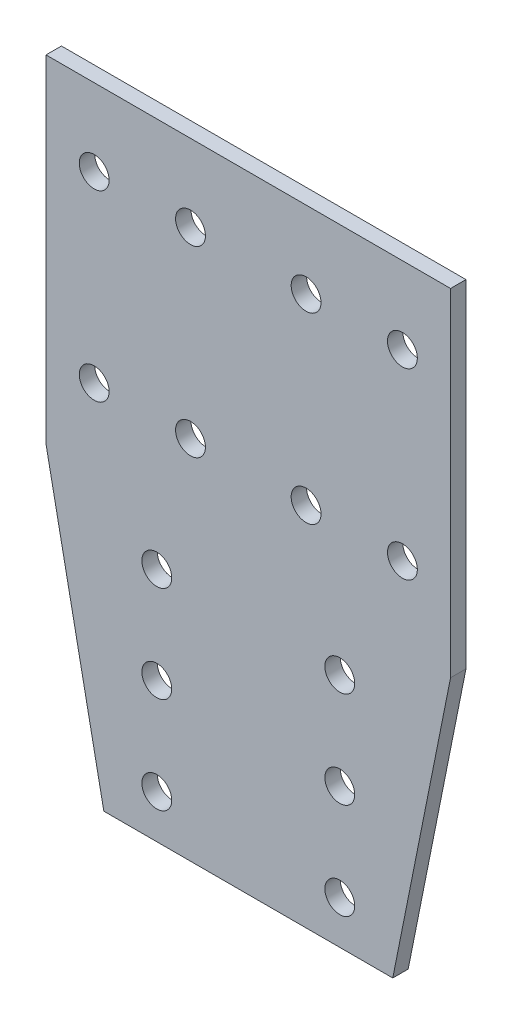
ISO-10303-21;
HEADER;
FILE_DESCRIPTION(('STEP AP214'),'2;1');
FILE_NAME('part.step','',(''),(''),'','','');
FILE_SCHEMA(('AUTOMOTIVE_DESIGN { 1 0 10303 214 1 1 1 1 }'));
ENDSEC;
DATA;
#1=APPLICATION_CONTEXT('core data for automotive mechanical design processes');
#2=APPLICATION_PROTOCOL_DEFINITION('international standard','automotive_design',2000,#1);
#3=PRODUCT_CONTEXT('',#1,'mechanical');
#4=PRODUCT('Part','Part','',(#3));
#5=PRODUCT_RELATED_PRODUCT_CATEGORY('part','',(#4));
#6=PRODUCT_DEFINITION_FORMATION('','',#4);
#7=PRODUCT_DEFINITION_CONTEXT('part definition',#1,'design');
#8=PRODUCT_DEFINITION('design','',#6,#7);
#9=PRODUCT_DEFINITION_SHAPE('','',#8);
#10=(LENGTH_UNIT() NAMED_UNIT(*) SI_UNIT(.MILLI.,.METRE.));
#11=(NAMED_UNIT(*) PLANE_ANGLE_UNIT() SI_UNIT($,.RADIAN.));
#12=(NAMED_UNIT(*) SI_UNIT($,.STERADIAN.) SOLID_ANGLE_UNIT());
#13=UNCERTAINTY_MEASURE_WITH_UNIT(LENGTH_MEASURE(1.E-05),#10,'distance_accuracy_value','');
#14=(GEOMETRIC_REPRESENTATION_CONTEXT(3) GLOBAL_UNCERTAINTY_ASSIGNED_CONTEXT((#13)) GLOBAL_UNIT_ASSIGNED_CONTEXT((#10,
#11,#12)) REPRESENTATION_CONTEXT('',''));
#15=CARTESIAN_POINT('',(0.,0.,0.));
#16=DIRECTION('',(0.,0.,1.));
#17=DIRECTION('',(1.,0.,0.));
#18=AXIS2_PLACEMENT_3D('',#15,#16,#17);
#19=CARTESIAN_POINT('',(-39.2199094965854,-300.,16.));
#20=DIRECTION('',(0.,0.,1.));
#21=DIRECTION('',(1.,0.,0.));
#22=AXIS2_PLACEMENT_3D('',#19,#20,#21);
#23=PLANE('',#22);
#24=CARTESIAN_POINT('',(265.780090503415,-54.9999999999999,16.));
#25=DIRECTION('',(0.,0.,1.));
#26=DIRECTION('',(-1.,0.,0.));
#27=AXIS2_PLACEMENT_3D('',#24,#25,#26);
#28=CIRCLE('',#27,15.5);
#29=CARTESIAN_POINT('',(250.280090503415,-54.9999999999999,16.));
#30=VERTEX_POINT('',#29);
#31=EDGE_CURVE('E227',#30,#30,#28,.T.);
#32=ORIENTED_EDGE('',*,*,#31,.F.);
#33=EDGE_LOOP('',(#32));
#34=FACE_BOUND('',#33,.T.);
#35=CARTESIAN_POINT('',(230.780090503415,80.0000000000001,16.));
#36=DIRECTION('',(0.,0.,1.));
#37=DIRECTION('',(-1.,0.,0.));
#38=AXIS2_PLACEMENT_3D('',#35,#36,#37);
#39=CIRCLE('',#38,15.5);
#40=CARTESIAN_POINT('',(215.280090503415,80.0000000000001,16.));
#41=VERTEX_POINT('',#40);
#42=EDGE_CURVE('E239',#41,#41,#39,.T.);
#43=ORIENTED_EDGE('',*,*,#42,.F.);
#44=EDGE_LOOP('',(#43));
#45=FACE_BOUND('',#44,.T.);
#46=CARTESIAN_POINT('',(230.780090503415,270.,16.));
#47=DIRECTION('',(0.,0.,1.));
#48=DIRECTION('',(1.,0.,0.));
#49=AXIS2_PLACEMENT_3D('',#46,#47,#48);
#50=CIRCLE('',#49,15.5);
#51=CARTESIAN_POINT('',(246.280090503415,270.,16.));
#52=VERTEX_POINT('',#51);
#53=EDGE_CURVE('E251',#52,#52,#50,.T.);
#54=ORIENTED_EDGE('',*,*,#53,.F.);
#55=EDGE_LOOP('',(#54));
#56=FACE_BOUND('',#55,.T.);
#57=CARTESIAN_POINT('',(10.7800905034145,270.,16.));
#58=DIRECTION('',(0.,0.,1.));
#59=DIRECTION('',(-1.,0.,0.));
#60=AXIS2_PLACEMENT_3D('',#57,#58,#59);
#61=CIRCLE('',#60,15.5);
#62=CARTESIAN_POINT('',(-4.71990949658551,270.,16.));
#63=VERTEX_POINT('',#62);
#64=EDGE_CURVE('E263',#63,#63,#61,.T.);
#65=ORIENTED_EDGE('',*,*,#64,.F.);
#66=EDGE_LOOP('',(#65));
#67=FACE_BOUND('',#66,.T.);
#68=CARTESIAN_POINT('',(10.7800905034145,80.0000000000001,16.));
#69=DIRECTION('',(0.,0.,1.));
#70=DIRECTION('',(1.,0.,0.));
#71=AXIS2_PLACEMENT_3D('',#68,#69,#70);
#72=CIRCLE('',#71,15.5);
#73=CARTESIAN_POINT('',(26.2800905034145,80.0000000000001,16.));
#74=VERTEX_POINT('',#73);
#75=EDGE_CURVE('E275',#74,#74,#72,.T.);
#76=ORIENTED_EDGE('',*,*,#75,.F.);
#77=EDGE_LOOP('',(#76));
#78=FACE_BOUND('',#77,.T.);
#79=CARTESIAN_POINT('',(75.7800905034145,-155.,16.));
#80=DIRECTION('',(0.,0.,1.));
#81=DIRECTION('',(1.,0.,0.));
#82=AXIS2_PLACEMENT_3D('',#79,#80,#81);
#83=CIRCLE('',#82,15.5);
#84=CARTESIAN_POINT('',(91.2800905034145,-155.,16.));
#85=VERTEX_POINT('',#84);
#86=EDGE_CURVE('E287',#85,#85,#83,.T.);
#87=ORIENTED_EDGE('',*,*,#86,.F.);
#88=EDGE_LOOP('',(#87));
#89=FACE_BOUND('',#88,.T.);
#90=CARTESIAN_POINT('',(75.7800905034145,-54.9999999999999,16.));
#91=DIRECTION('',(0.,0.,1.));
#92=DIRECTION('',(1.,0.,0.));
#93=AXIS2_PLACEMENT_3D('',#90,#91,#92);
#94=CIRCLE('',#93,15.5);
#95=CARTESIAN_POINT('',(91.2800905034145,-54.9999999999999,16.));
#96=VERTEX_POINT('',#95);
#97=EDGE_CURVE('E119',#96,#96,#94,.T.);
#98=ORIENTED_EDGE('',*,*,#97,.F.);
#99=EDGE_LOOP('',(#98));
#100=FACE_BOUND('',#99,.T.);
#101=DIRECTION('',(0.,-1.,0.));
#102=VECTOR('',#101,1.);
#103=CARTESIAN_POINT('',(-39.2199094965855,350.,16.));
#104=LINE('',#103,#102);
#105=CARTESIAN_POINT('',(-39.2199094965855,350.,16.));
#106=VERTEX_POINT('',#105);
#107=CARTESIAN_POINT('',(-39.2199094965854,0.,16.));
#108=VERTEX_POINT('',#107);
#109=EDGE_CURVE('E126',#106,#108,#104,.T.);
#110=ORIENTED_EDGE('',*,*,#109,.T.);
#111=DIRECTION('',(0.196116135138184,-0.98058067569092,0.));
#112=VECTOR('',#111,1.);
#113=CARTESIAN_POINT('',(-39.2199094965854,0.,16.));
#114=LINE('',#113,#112);
#115=CARTESIAN_POINT('',(20.7800905034145,-300.,16.));
#116=VERTEX_POINT('',#115);
#117=EDGE_CURVE('E84',#108,#116,#114,.T.);
#118=ORIENTED_EDGE('',*,*,#117,.T.);
#119=DIRECTION('',(1.,0.,0.));
#120=VECTOR('',#119,1.);
#121=CARTESIAN_POINT('',(20.7800905034145,-300.,16.));
#122=LINE('',#121,#120);
#123=CARTESIAN_POINT('',(320.780090503414,-300.,16.));
#124=VERTEX_POINT('',#123);
#125=EDGE_CURVE('E97',#116,#124,#122,.T.);
#126=ORIENTED_EDGE('',*,*,#125,.T.);
#127=DIRECTION('',(0.196116135138184,0.98058067569092,0.));
#128=VECTOR('',#127,1.);
#129=CARTESIAN_POINT('',(380.780090503414,0.,16.));
#130=LINE('',#129,#128);
#131=CARTESIAN_POINT('',(380.780090503414,0.,16.));
#132=VERTEX_POINT('',#131);
#133=EDGE_CURVE('E91',#124,#132,#130,.T.);
#134=ORIENTED_EDGE('',*,*,#133,.T.);
#135=DIRECTION('',(0.,1.,0.));
#136=VECTOR('',#135,1.);
#137=CARTESIAN_POINT('',(380.780090503414,350.,16.));
#138=LINE('',#137,#136);
#139=CARTESIAN_POINT('',(380.780090503414,350.,16.));
#140=VERTEX_POINT('',#139);
#141=EDGE_CURVE('E95',#132,#140,#138,.T.);
#142=ORIENTED_EDGE('',*,*,#141,.T.);
#143=DIRECTION('',(-1.,0.,0.));
#144=VECTOR('',#143,1.);
#145=CARTESIAN_POINT('',(380.780090503414,350.,16.));
#146=LINE('',#145,#144);
#147=EDGE_CURVE('E47',#140,#106,#146,.T.);
#148=ORIENTED_EDGE('',*,*,#147,.T.);
#149=EDGE_LOOP('',(#110,#118,#126,#134,#142,#148));
#150=FACE_BOUND('',#149,.T.);
#151=CARTESIAN_POINT('',(75.7800905034145,-255.,16.));
#152=DIRECTION('',(0.,0.,1.));
#153=DIRECTION('',(1.,0.,0.));
#154=AXIS2_PLACEMENT_3D('',#151,#152,#153);
#155=CIRCLE('',#154,15.5);
#156=CARTESIAN_POINT('',(91.2800905034145,-255.,16.));
#157=VERTEX_POINT('',#156);
#158=EDGE_CURVE('E293',#157,#157,#155,.T.);
#159=ORIENTED_EDGE('',*,*,#158,.F.);
#160=EDGE_LOOP('',(#159));
#161=FACE_BOUND('',#160,.T.);
#162=CARTESIAN_POINT('',(110.780090503414,80.0000000000001,16.));
#163=DIRECTION('',(0.,0.,1.));
#164=DIRECTION('',(1.,0.,0.));
#165=AXIS2_PLACEMENT_3D('',#162,#163,#164);
#166=CIRCLE('',#165,15.5);
#167=CARTESIAN_POINT('',(126.280090503414,80.0000000000001,16.));
#168=VERTEX_POINT('',#167);
#169=EDGE_CURVE('E281',#168,#168,#166,.T.);
#170=ORIENTED_EDGE('',*,*,#169,.F.);
#171=EDGE_LOOP('',(#170));
#172=FACE_BOUND('',#171,.T.);
#173=CARTESIAN_POINT('',(110.780090503414,270.,16.));
#174=DIRECTION('',(0.,0.,1.));
#175=DIRECTION('',(-1.,0.,0.));
#176=AXIS2_PLACEMENT_3D('',#173,#174,#175);
#177=CIRCLE('',#176,15.5);
#178=CARTESIAN_POINT('',(95.2800905034145,270.,16.));
#179=VERTEX_POINT('',#178);
#180=EDGE_CURVE('E269',#179,#179,#177,.T.);
#181=ORIENTED_EDGE('',*,*,#180,.F.);
#182=EDGE_LOOP('',(#181));
#183=FACE_BOUND('',#182,.T.);
#184=CARTESIAN_POINT('',(330.780090503415,270.,16.));
#185=DIRECTION('',(0.,0.,1.));
#186=DIRECTION('',(1.,0.,0.));
#187=AXIS2_PLACEMENT_3D('',#184,#185,#186);
#188=CIRCLE('',#187,15.5);
#189=CARTESIAN_POINT('',(346.280090503415,270.,16.));
#190=VERTEX_POINT('',#189);
#191=EDGE_CURVE('E257',#190,#190,#188,.T.);
#192=ORIENTED_EDGE('',*,*,#191,.F.);
#193=EDGE_LOOP('',(#192));
#194=FACE_BOUND('',#193,.T.);
#195=CARTESIAN_POINT('',(330.780090503415,80.0000000000001,16.));
#196=DIRECTION('',(0.,0.,1.));
#197=DIRECTION('',(-1.,0.,0.));
#198=AXIS2_PLACEMENT_3D('',#195,#196,#197);
#199=CIRCLE('',#198,15.5);
#200=CARTESIAN_POINT('',(315.280090503415,80.0000000000001,16.));
#201=VERTEX_POINT('',#200);
#202=EDGE_CURVE('E245',#201,#201,#199,.T.);
#203=ORIENTED_EDGE('',*,*,#202,.F.);
#204=EDGE_LOOP('',(#203));
#205=FACE_BOUND('',#204,.T.);
#206=CARTESIAN_POINT('',(265.780090503415,-155.,16.));
#207=DIRECTION('',(0.,0.,1.));
#208=DIRECTION('',(-1.,0.,0.));
#209=AXIS2_PLACEMENT_3D('',#206,#207,#208);
#210=CIRCLE('',#209,15.5);
#211=CARTESIAN_POINT('',(250.280090503415,-155.,16.));
#212=VERTEX_POINT('',#211);
#213=EDGE_CURVE('E233',#212,#212,#210,.T.);
#214=ORIENTED_EDGE('',*,*,#213,.F.);
#215=EDGE_LOOP('',(#214));
#216=FACE_BOUND('',#215,.T.);
#217=CARTESIAN_POINT('',(265.780090503415,-255.,16.));
#218=DIRECTION('',(0.,0.,1.));
#219=DIRECTION('',(-1.,0.,0.));
#220=AXIS2_PLACEMENT_3D('',#217,#218,#219);
#221=CIRCLE('',#220,15.5);
#222=CARTESIAN_POINT('',(250.280090503415,-255.,16.));
#223=VERTEX_POINT('',#222);
#224=EDGE_CURVE('E218',#223,#223,#221,.T.);
#225=ORIENTED_EDGE('',*,*,#224,.F.);
#226=EDGE_LOOP('',(#225));
#227=FACE_BOUND('',#226,.T.);
#228=ADVANCED_FACE('F30',(#34,#45,#56,#67,#78,#89,#100,#150,#161,#172,#183,#194,#205,#216,#227),
#23,.T.);
#229=CARTESIAN_POINT('',(-39.2199094965854,-300.,0.));
#230=DIRECTION('',(0.,0.,1.));
#231=DIRECTION('',(1.,0.,0.));
#232=AXIS2_PLACEMENT_3D('',#229,#230,#231);
#233=PLANE('',#232);
#234=CARTESIAN_POINT('',(265.780090503415,-54.9999999999999,0.));
#235=DIRECTION('',(0.,0.,1.));
#236=DIRECTION('',(-1.,0.,0.));
#237=AXIS2_PLACEMENT_3D('',#234,#235,#236);
#238=CIRCLE('',#237,15.5);
#239=CARTESIAN_POINT('',(250.280090503415,-54.9999999999999,0.));
#240=VERTEX_POINT('',#239);
#241=EDGE_CURVE('E224',#240,#240,#238,.T.);
#242=ORIENTED_EDGE('',*,*,#241,.T.);
#243=EDGE_LOOP('',(#242));
#244=FACE_BOUND('',#243,.T.);
#245=CARTESIAN_POINT('',(230.780090503415,80.0000000000001,0.));
#246=DIRECTION('',(0.,0.,1.));
#247=DIRECTION('',(-1.,0.,0.));
#248=AXIS2_PLACEMENT_3D('',#245,#246,#247);
#249=CIRCLE('',#248,15.5);
#250=CARTESIAN_POINT('',(215.280090503415,80.0000000000001,0.));
#251=VERTEX_POINT('',#250);
#252=EDGE_CURVE('E236',#251,#251,#249,.T.);
#253=ORIENTED_EDGE('',*,*,#252,.T.);
#254=EDGE_LOOP('',(#253));
#255=FACE_BOUND('',#254,.T.);
#256=CARTESIAN_POINT('',(230.780090503415,270.,0.));
#257=DIRECTION('',(0.,0.,1.));
#258=DIRECTION('',(1.,0.,0.));
#259=AXIS2_PLACEMENT_3D('',#256,#257,#258);
#260=CIRCLE('',#259,15.5);
#261=CARTESIAN_POINT('',(246.280090503415,270.,0.));
#262=VERTEX_POINT('',#261);
#263=EDGE_CURVE('E248',#262,#262,#260,.T.);
#264=ORIENTED_EDGE('',*,*,#263,.T.);
#265=EDGE_LOOP('',(#264));
#266=FACE_BOUND('',#265,.T.);
#267=CARTESIAN_POINT('',(10.7800905034145,270.,0.));
#268=DIRECTION('',(0.,0.,1.));
#269=DIRECTION('',(-1.,0.,0.));
#270=AXIS2_PLACEMENT_3D('',#267,#268,#269);
#271=CIRCLE('',#270,15.5);
#272=CARTESIAN_POINT('',(-4.71990949658551,270.,0.));
#273=VERTEX_POINT('',#272);
#274=EDGE_CURVE('E260',#273,#273,#271,.T.);
#275=ORIENTED_EDGE('',*,*,#274,.T.);
#276=EDGE_LOOP('',(#275));
#277=FACE_BOUND('',#276,.T.);
#278=CARTESIAN_POINT('',(10.7800905034145,80.0000000000001,0.));
#279=DIRECTION('',(0.,0.,1.));
#280=DIRECTION('',(1.,0.,0.));
#281=AXIS2_PLACEMENT_3D('',#278,#279,#280);
#282=CIRCLE('',#281,15.5);
#283=CARTESIAN_POINT('',(26.2800905034145,80.0000000000001,0.));
#284=VERTEX_POINT('',#283);
#285=EDGE_CURVE('E272',#284,#284,#282,.T.);
#286=ORIENTED_EDGE('',*,*,#285,.T.);
#287=EDGE_LOOP('',(#286));
#288=FACE_BOUND('',#287,.T.);
#289=CARTESIAN_POINT('',(75.7800905034145,-155.,0.));
#290=DIRECTION('',(0.,0.,1.));
#291=DIRECTION('',(1.,0.,0.));
#292=AXIS2_PLACEMENT_3D('',#289,#290,#291);
#293=CIRCLE('',#292,15.5);
#294=CARTESIAN_POINT('',(91.2800905034145,-155.,0.));
#295=VERTEX_POINT('',#294);
#296=EDGE_CURVE('E284',#295,#295,#293,.T.);
#297=ORIENTED_EDGE('',*,*,#296,.T.);
#298=EDGE_LOOP('',(#297));
#299=FACE_BOUND('',#298,.T.);
#300=CARTESIAN_POINT('',(75.7800905034145,-54.9999999999999,0.));
#301=DIRECTION('',(0.,0.,1.));
#302=DIRECTION('',(1.,0.,0.));
#303=AXIS2_PLACEMENT_3D('',#300,#301,#302);
#304=CIRCLE('',#303,15.5);
#305=CARTESIAN_POINT('',(91.2800905034145,-54.9999999999999,0.));
#306=VERTEX_POINT('',#305);
#307=EDGE_CURVE('E296',#306,#306,#304,.T.);
#308=ORIENTED_EDGE('',*,*,#307,.T.);
#309=EDGE_LOOP('',(#308));
#310=FACE_BOUND('',#309,.T.);
#311=DIRECTION('',(0.,-1.,0.));
#312=VECTOR('',#311,1.);
#313=CARTESIAN_POINT('',(-39.2199094965855,350.,0.));
#314=LINE('',#313,#312);
#315=CARTESIAN_POINT('',(-39.2199094965855,350.,0.));
#316=VERTEX_POINT('',#315);
#317=CARTESIAN_POINT('',(-39.2199094965854,0.,0.));
#318=VERTEX_POINT('',#317);
#319=EDGE_CURVE('E115',#316,#318,#314,.T.);
#320=ORIENTED_EDGE('',*,*,#319,.F.);
#321=DIRECTION('',(-1.,0.,0.));
#322=VECTOR('',#321,1.);
#323=CARTESIAN_POINT('',(380.780090503414,350.,0.));
#324=LINE('',#323,#322);
#325=CARTESIAN_POINT('',(380.780090503414,350.,0.));
#326=VERTEX_POINT('',#325);
#327=EDGE_CURVE('E76',#326,#316,#324,.T.);
#328=ORIENTED_EDGE('',*,*,#327,.F.);
#329=DIRECTION('',(0.,1.,0.));
#330=VECTOR('',#329,1.);
#331=CARTESIAN_POINT('',(380.780090503414,350.,0.));
#332=LINE('',#331,#330);
#333=CARTESIAN_POINT('',(380.780090503414,0.,0.));
#334=VERTEX_POINT('',#333);
#335=EDGE_CURVE('E70',#334,#326,#332,.T.);
#336=ORIENTED_EDGE('',*,*,#335,.F.);
#337=DIRECTION('',(0.196116135138184,0.98058067569092,0.));
#338=VECTOR('',#337,1.);
#339=CARTESIAN_POINT('',(380.780090503414,0.,0.));
#340=LINE('',#339,#338);
#341=CARTESIAN_POINT('',(320.780090503414,-300.,0.));
#342=VERTEX_POINT('',#341);
#343=EDGE_CURVE('E105',#342,#334,#340,.T.);
#344=ORIENTED_EDGE('',*,*,#343,.F.);
#345=DIRECTION('',(1.,0.,0.));
#346=VECTOR('',#345,1.);
#347=CARTESIAN_POINT('',(20.7800905034145,-300.,0.));
#348=LINE('',#347,#346);
#349=CARTESIAN_POINT('',(20.7800905034145,-300.,0.));
#350=VERTEX_POINT('',#349);
#351=EDGE_CURVE('E121',#350,#342,#348,.T.);
#352=ORIENTED_EDGE('',*,*,#351,.F.);
#353=DIRECTION('',(0.196116135138184,-0.98058067569092,0.));
#354=VECTOR('',#353,1.);
#355=CARTESIAN_POINT('',(-39.2199094965854,0.,0.));
#356=LINE('',#355,#354);
#357=EDGE_CURVE('E118',#318,#350,#356,.T.);
#358=ORIENTED_EDGE('',*,*,#357,.F.);
#359=EDGE_LOOP('',(#320,#328,#336,#344,#352,#358));
#360=FACE_BOUND('',#359,.T.);
#361=CARTESIAN_POINT('',(75.7800905034145,-255.,0.));
#362=DIRECTION('',(0.,0.,1.));
#363=DIRECTION('',(1.,0.,0.));
#364=AXIS2_PLACEMENT_3D('',#361,#362,#363);
#365=CIRCLE('',#364,15.5);
#366=CARTESIAN_POINT('',(91.2800905034145,-255.,0.));
#367=VERTEX_POINT('',#366);
#368=EDGE_CURVE('E290',#367,#367,#365,.T.);
#369=ORIENTED_EDGE('',*,*,#368,.T.);
#370=EDGE_LOOP('',(#369));
#371=FACE_BOUND('',#370,.T.);
#372=CARTESIAN_POINT('',(110.780090503414,80.0000000000001,0.));
#373=DIRECTION('',(0.,0.,1.));
#374=DIRECTION('',(1.,0.,0.));
#375=AXIS2_PLACEMENT_3D('',#372,#373,#374);
#376=CIRCLE('',#375,15.5);
#377=CARTESIAN_POINT('',(126.280090503414,80.0000000000001,0.));
#378=VERTEX_POINT('',#377);
#379=EDGE_CURVE('E278',#378,#378,#376,.T.);
#380=ORIENTED_EDGE('',*,*,#379,.T.);
#381=EDGE_LOOP('',(#380));
#382=FACE_BOUND('',#381,.T.);
#383=CARTESIAN_POINT('',(110.780090503414,270.,0.));
#384=DIRECTION('',(0.,0.,1.));
#385=DIRECTION('',(-1.,0.,0.));
#386=AXIS2_PLACEMENT_3D('',#383,#384,#385);
#387=CIRCLE('',#386,15.5);
#388=CARTESIAN_POINT('',(95.2800905034145,270.,0.));
#389=VERTEX_POINT('',#388);
#390=EDGE_CURVE('E266',#389,#389,#387,.T.);
#391=ORIENTED_EDGE('',*,*,#390,.T.);
#392=EDGE_LOOP('',(#391));
#393=FACE_BOUND('',#392,.T.);
#394=CARTESIAN_POINT('',(330.780090503415,270.,0.));
#395=DIRECTION('',(0.,0.,1.));
#396=DIRECTION('',(1.,0.,0.));
#397=AXIS2_PLACEMENT_3D('',#394,#395,#396);
#398=CIRCLE('',#397,15.5);
#399=CARTESIAN_POINT('',(346.280090503415,270.,0.));
#400=VERTEX_POINT('',#399);
#401=EDGE_CURVE('E254',#400,#400,#398,.T.);
#402=ORIENTED_EDGE('',*,*,#401,.T.);
#403=EDGE_LOOP('',(#402));
#404=FACE_BOUND('',#403,.T.);
#405=CARTESIAN_POINT('',(330.780090503415,80.0000000000001,0.));
#406=DIRECTION('',(0.,0.,1.));
#407=DIRECTION('',(-1.,0.,0.));
#408=AXIS2_PLACEMENT_3D('',#405,#406,#407);
#409=CIRCLE('',#408,15.5);
#410=CARTESIAN_POINT('',(315.280090503415,80.0000000000001,0.));
#411=VERTEX_POINT('',#410);
#412=EDGE_CURVE('E242',#411,#411,#409,.T.);
#413=ORIENTED_EDGE('',*,*,#412,.T.);
#414=EDGE_LOOP('',(#413));
#415=FACE_BOUND('',#414,.T.);
#416=CARTESIAN_POINT('',(265.780090503415,-155.,0.));
#417=DIRECTION('',(0.,0.,1.));
#418=DIRECTION('',(-1.,0.,0.));
#419=AXIS2_PLACEMENT_3D('',#416,#417,#418);
#420=CIRCLE('',#419,15.5);
#421=CARTESIAN_POINT('',(250.280090503415,-155.,0.));
#422=VERTEX_POINT('',#421);
#423=EDGE_CURVE('E230',#422,#422,#420,.T.);
#424=ORIENTED_EDGE('',*,*,#423,.T.);
#425=EDGE_LOOP('',(#424));
#426=FACE_BOUND('',#425,.T.);
#427=CARTESIAN_POINT('',(265.780090503415,-255.,0.));
#428=DIRECTION('',(0.,0.,1.));
#429=DIRECTION('',(-1.,0.,0.));
#430=AXIS2_PLACEMENT_3D('',#427,#428,#429);
#431=CIRCLE('',#430,15.5);
#432=CARTESIAN_POINT('',(250.280090503415,-255.,0.));
#433=VERTEX_POINT('',#432);
#434=EDGE_CURVE('E221',#433,#433,#431,.T.);
#435=ORIENTED_EDGE('',*,*,#434,.T.);
#436=EDGE_LOOP('',(#435));
#437=FACE_BOUND('',#436,.T.);
#438=ADVANCED_FACE('F135',(#244,#255,#266,#277,#288,#299,#310,#360,#371,#382,#393,#404,#415,
#426,#437),#233,.F.);
#439=CARTESIAN_POINT('',(-39.2199094965855,350.,16.));
#440=DIRECTION('',(1.,0.,0.));
#441=DIRECTION('',(0.,1.,0.));
#442=AXIS2_PLACEMENT_3D('',#439,#440,#441);
#443=PLANE('',#442);
#444=ORIENTED_EDGE('',*,*,#319,.T.);
#445=DIRECTION('',(0.,0.,-1.));
#446=VECTOR('',#445,1.);
#447=CARTESIAN_POINT('',(-39.2199094965854,0.,16.));
#448=LINE('',#447,#446);
#449=EDGE_CURVE('E11',#108,#318,#448,.T.);
#450=ORIENTED_EDGE('',*,*,#449,.F.);
#451=ORIENTED_EDGE('',*,*,#109,.F.);
#452=DIRECTION('',(0.,0.,-1.));
#453=VECTOR('',#452,1.);
#454=CARTESIAN_POINT('',(-39.2199094965855,350.,16.));
#455=LINE('',#454,#453);
#456=EDGE_CURVE('E111',#106,#316,#455,.T.);
#457=ORIENTED_EDGE('',*,*,#456,.T.);
#458=EDGE_LOOP('',(#444,#450,#451,#457));
#459=FACE_BOUND('',#458,.T.);
#460=ADVANCED_FACE('F32',(#459),#443,.F.);
#461=CARTESIAN_POINT('',(-39.2199094965854,0.,16.));
#462=DIRECTION('',(0.98058067569092,0.196116135138184,0.));
#463=DIRECTION('',(-0.196116135138184,0.98058067569092,0.));
#464=AXIS2_PLACEMENT_3D('',#461,#462,#463);
#465=PLANE('',#464);
#466=ORIENTED_EDGE('',*,*,#357,.T.);
#467=DIRECTION('',(0.,0.,-1.));
#468=VECTOR('',#467,1.);
#469=CARTESIAN_POINT('',(20.7800905034145,-300.,16.));
#470=LINE('',#469,#468);
#471=EDGE_CURVE('E39',#116,#350,#470,.T.);
#472=ORIENTED_EDGE('',*,*,#471,.F.);
#473=ORIENTED_EDGE('',*,*,#117,.F.);
#474=ORIENTED_EDGE('',*,*,#449,.T.);
#475=EDGE_LOOP('',(#466,#472,#473,#474));
#476=FACE_BOUND('',#475,.T.);
#477=ADVANCED_FACE('F443',(#476),#465,.F.);
#478=CARTESIAN_POINT('',(20.7800905034145,-300.,16.));
#479=DIRECTION('',(0.,1.,0.));
#480=DIRECTION('',(0.,0.,1.));
#481=AXIS2_PLACEMENT_3D('',#478,#479,#480);
#482=PLANE('',#481);
#483=ORIENTED_EDGE('',*,*,#351,.T.);
#484=DIRECTION('',(0.,0.,-1.));
#485=VECTOR('',#484,1.);
#486=CARTESIAN_POINT('',(320.780090503414,-300.,16.));
#487=LINE('',#486,#485);
#488=EDGE_CURVE('E106',#124,#342,#487,.T.);
#489=ORIENTED_EDGE('',*,*,#488,.F.);
#490=ORIENTED_EDGE('',*,*,#125,.F.);
#491=ORIENTED_EDGE('',*,*,#471,.T.);
#492=EDGE_LOOP('',(#483,#489,#490,#491));
#493=FACE_BOUND('',#492,.T.);
#494=ADVANCED_FACE('F132',(#493),#482,.F.);
#495=CARTESIAN_POINT('',(380.780090503414,0.,16.));
#496=DIRECTION('',(-0.98058067569092,0.196116135138184,0.));
#497=DIRECTION('',(-0.196116135138184,-0.98058067569092,0.));
#498=AXIS2_PLACEMENT_3D('',#495,#496,#497);
#499=PLANE('',#498);
#500=ORIENTED_EDGE('',*,*,#343,.T.);
#501=DIRECTION('',(0.,0.,-1.));
#502=VECTOR('',#501,1.);
#503=CARTESIAN_POINT('',(380.780090503414,0.,16.));
#504=LINE('',#503,#502);
#505=EDGE_CURVE('E102',#132,#334,#504,.T.);
#506=ORIENTED_EDGE('',*,*,#505,.F.);
#507=ORIENTED_EDGE('',*,*,#133,.F.);
#508=ORIENTED_EDGE('',*,*,#488,.T.);
#509=EDGE_LOOP('',(#500,#506,#507,#508));
#510=FACE_BOUND('',#509,.T.);
#511=ADVANCED_FACE('F103',(#510),#499,.F.);
#512=CARTESIAN_POINT('',(380.780090503414,350.,16.));
#513=DIRECTION('',(-1.,0.,0.));
#514=DIRECTION('',(0.,0.,1.));
#515=AXIS2_PLACEMENT_3D('',#512,#513,#514);
#516=PLANE('',#515);
#517=ORIENTED_EDGE('',*,*,#335,.T.);
#518=DIRECTION('',(0.,0.,-1.));
#519=VECTOR('',#518,1.);
#520=CARTESIAN_POINT('',(380.780090503414,350.,16.));
#521=LINE('',#520,#519);
#522=EDGE_CURVE('E107',#140,#326,#521,.T.);
#523=ORIENTED_EDGE('',*,*,#522,.F.);
#524=ORIENTED_EDGE('',*,*,#141,.F.);
#525=ORIENTED_EDGE('',*,*,#505,.T.);
#526=EDGE_LOOP('',(#517,#523,#524,#525));
#527=FACE_BOUND('',#526,.T.);
#528=ADVANCED_FACE('F109',(#527),#516,.F.);
#529=CARTESIAN_POINT('',(380.780090503414,350.,16.));
#530=DIRECTION('',(0.,-1.,0.));
#531=DIRECTION('',(0.,0.,-1.));
#532=AXIS2_PLACEMENT_3D('',#529,#530,#531);
#533=PLANE('',#532);
#534=ORIENTED_EDGE('',*,*,#327,.T.);
#535=ORIENTED_EDGE('',*,*,#456,.F.);
#536=ORIENTED_EDGE('',*,*,#147,.F.);
#537=ORIENTED_EDGE('',*,*,#522,.T.);
#538=EDGE_LOOP('',(#534,#535,#536,#537));
#539=FACE_BOUND('',#538,.T.);
#540=ADVANCED_FACE('F140',(#539),#533,.F.);
#541=CARTESIAN_POINT('',(75.7800905034145,-54.9999999999999,16.));
#542=DIRECTION('',(0.,0.,-1.));
#543=DIRECTION('',(-1.,0.,0.));
#544=AXIS2_PLACEMENT_3D('',#541,#542,#543);
#545=CYLINDRICAL_SURFACE('',#544,15.5);
#546=ORIENTED_EDGE('',*,*,#97,.T.);
#547=EDGE_LOOP('',(#546));
#548=FACE_BOUND('',#547,.T.);
#549=ORIENTED_EDGE('',*,*,#307,.F.);
#550=EDGE_LOOP('',(#549));
#551=FACE_BOUND('',#550,.T.);
#552=ADVANCED_FACE('F142',(#548,#551),#545,.F.);
#553=CARTESIAN_POINT('',(75.7800905034145,-255.,16.));
#554=DIRECTION('',(0.,0.,-1.));
#555=DIRECTION('',(-1.,0.,0.));
#556=AXIS2_PLACEMENT_3D('',#553,#554,#555);
#557=CYLINDRICAL_SURFACE('',#556,15.5);
#558=ORIENTED_EDGE('',*,*,#158,.T.);
#559=EDGE_LOOP('',(#558));
#560=FACE_BOUND('',#559,.T.);
#561=ORIENTED_EDGE('',*,*,#368,.F.);
#562=EDGE_LOOP('',(#561));
#563=FACE_BOUND('',#562,.T.);
#564=ADVANCED_FACE('F148',(#560,#563),#557,.F.);
#565=CARTESIAN_POINT('',(75.7800905034145,-155.,16.));
#566=DIRECTION('',(0.,0.,-1.));
#567=DIRECTION('',(-1.,0.,0.));
#568=AXIS2_PLACEMENT_3D('',#565,#566,#567);
#569=CYLINDRICAL_SURFACE('',#568,15.5);
#570=ORIENTED_EDGE('',*,*,#86,.T.);
#571=EDGE_LOOP('',(#570));
#572=FACE_BOUND('',#571,.T.);
#573=ORIENTED_EDGE('',*,*,#296,.F.);
#574=EDGE_LOOP('',(#573));
#575=FACE_BOUND('',#574,.T.);
#576=ADVANCED_FACE('F165',(#572,#575),#569,.F.);
#577=CARTESIAN_POINT('',(110.780090503414,80.0000000000001,16.));
#578=DIRECTION('',(0.,0.,-1.));
#579=DIRECTION('',(-1.,0.,0.));
#580=AXIS2_PLACEMENT_3D('',#577,#578,#579);
#581=CYLINDRICAL_SURFACE('',#580,15.5);
#582=ORIENTED_EDGE('',*,*,#169,.T.);
#583=EDGE_LOOP('',(#582));
#584=FACE_BOUND('',#583,.T.);
#585=ORIENTED_EDGE('',*,*,#379,.F.);
#586=EDGE_LOOP('',(#585));
#587=FACE_BOUND('',#586,.T.);
#588=ADVANCED_FACE('F169',(#584,#587),#581,.F.);
#589=CARTESIAN_POINT('',(10.7800905034145,80.0000000000001,16.));
#590=DIRECTION('',(0.,0.,-1.));
#591=DIRECTION('',(-1.,0.,0.));
#592=AXIS2_PLACEMENT_3D('',#589,#590,#591);
#593=CYLINDRICAL_SURFACE('',#592,15.5);
#594=ORIENTED_EDGE('',*,*,#75,.T.);
#595=EDGE_LOOP('',(#594));
#596=FACE_BOUND('',#595,.T.);
#597=ORIENTED_EDGE('',*,*,#285,.F.);
#598=EDGE_LOOP('',(#597));
#599=FACE_BOUND('',#598,.T.);
#600=ADVANCED_FACE('F173',(#596,#599),#593,.F.);
#601=CARTESIAN_POINT('',(110.780090503414,270.,16.));
#602=DIRECTION('',(0.,0.,-1.));
#603=DIRECTION('',(-1.,0.,0.));
#604=AXIS2_PLACEMENT_3D('',#601,#602,#603);
#605=CYLINDRICAL_SURFACE('',#604,15.5);
#606=ORIENTED_EDGE('',*,*,#180,.T.);
#607=EDGE_LOOP('',(#606));
#608=FACE_BOUND('',#607,.T.);
#609=ORIENTED_EDGE('',*,*,#390,.F.);
#610=EDGE_LOOP('',(#609));
#611=FACE_BOUND('',#610,.T.);
#612=ADVANCED_FACE('F177',(#608,#611),#605,.F.);
#613=CARTESIAN_POINT('',(10.7800905034145,270.,16.));
#614=DIRECTION('',(0.,0.,-1.));
#615=DIRECTION('',(-1.,0.,0.));
#616=AXIS2_PLACEMENT_3D('',#613,#614,#615);
#617=CYLINDRICAL_SURFACE('',#616,15.5);
#618=ORIENTED_EDGE('',*,*,#64,.T.);
#619=EDGE_LOOP('',(#618));
#620=FACE_BOUND('',#619,.T.);
#621=ORIENTED_EDGE('',*,*,#274,.F.);
#622=EDGE_LOOP('',(#621));
#623=FACE_BOUND('',#622,.T.);
#624=ADVANCED_FACE('F181',(#620,#623),#617,.F.);
#625=CARTESIAN_POINT('',(330.780090503415,270.,16.));
#626=DIRECTION('',(0.,0.,-1.));
#627=DIRECTION('',(-1.,0.,0.));
#628=AXIS2_PLACEMENT_3D('',#625,#626,#627);
#629=CYLINDRICAL_SURFACE('',#628,15.5);
#630=ORIENTED_EDGE('',*,*,#191,.T.);
#631=EDGE_LOOP('',(#630));
#632=FACE_BOUND('',#631,.T.);
#633=ORIENTED_EDGE('',*,*,#401,.F.);
#634=EDGE_LOOP('',(#633));
#635=FACE_BOUND('',#634,.T.);
#636=ADVANCED_FACE('F185',(#632,#635),#629,.F.);
#637=CARTESIAN_POINT('',(230.780090503415,270.,16.));
#638=DIRECTION('',(0.,0.,-1.));
#639=DIRECTION('',(-1.,0.,0.));
#640=AXIS2_PLACEMENT_3D('',#637,#638,#639);
#641=CYLINDRICAL_SURFACE('',#640,15.5);
#642=ORIENTED_EDGE('',*,*,#53,.T.);
#643=EDGE_LOOP('',(#642));
#644=FACE_BOUND('',#643,.T.);
#645=ORIENTED_EDGE('',*,*,#263,.F.);
#646=EDGE_LOOP('',(#645));
#647=FACE_BOUND('',#646,.T.);
#648=ADVANCED_FACE('F189',(#644,#647),#641,.F.);
#649=CARTESIAN_POINT('',(330.780090503415,80.0000000000001,16.));
#650=DIRECTION('',(0.,0.,-1.));
#651=DIRECTION('',(-1.,0.,0.));
#652=AXIS2_PLACEMENT_3D('',#649,#650,#651);
#653=CYLINDRICAL_SURFACE('',#652,15.5);
#654=ORIENTED_EDGE('',*,*,#202,.T.);
#655=EDGE_LOOP('',(#654));
#656=FACE_BOUND('',#655,.T.);
#657=ORIENTED_EDGE('',*,*,#412,.F.);
#658=EDGE_LOOP('',(#657));
#659=FACE_BOUND('',#658,.T.);
#660=ADVANCED_FACE('F193',(#656,#659),#653,.F.);
#661=CARTESIAN_POINT('',(230.780090503415,80.0000000000001,16.));
#662=DIRECTION('',(0.,0.,-1.));
#663=DIRECTION('',(-1.,0.,0.));
#664=AXIS2_PLACEMENT_3D('',#661,#662,#663);
#665=CYLINDRICAL_SURFACE('',#664,15.5);
#666=ORIENTED_EDGE('',*,*,#42,.T.);
#667=EDGE_LOOP('',(#666));
#668=FACE_BOUND('',#667,.T.);
#669=ORIENTED_EDGE('',*,*,#252,.F.);
#670=EDGE_LOOP('',(#669));
#671=FACE_BOUND('',#670,.T.);
#672=ADVANCED_FACE('F197',(#668,#671),#665,.F.);
#673=CARTESIAN_POINT('',(265.780090503415,-155.,16.));
#674=DIRECTION('',(0.,0.,-1.));
#675=DIRECTION('',(-1.,0.,0.));
#676=AXIS2_PLACEMENT_3D('',#673,#674,#675);
#677=CYLINDRICAL_SURFACE('',#676,15.5);
#678=ORIENTED_EDGE('',*,*,#213,.T.);
#679=EDGE_LOOP('',(#678));
#680=FACE_BOUND('',#679,.T.);
#681=ORIENTED_EDGE('',*,*,#423,.F.);
#682=EDGE_LOOP('',(#681));
#683=FACE_BOUND('',#682,.T.);
#684=ADVANCED_FACE('F201',(#680,#683),#677,.F.);
#685=CARTESIAN_POINT('',(265.780090503415,-54.9999999999999,16.));
#686=DIRECTION('',(0.,0.,-1.));
#687=DIRECTION('',(-1.,0.,0.));
#688=AXIS2_PLACEMENT_3D('',#685,#686,#687);
#689=CYLINDRICAL_SURFACE('',#688,15.5);
#690=ORIENTED_EDGE('',*,*,#31,.T.);
#691=EDGE_LOOP('',(#690));
#692=FACE_BOUND('',#691,.T.);
#693=ORIENTED_EDGE('',*,*,#241,.F.);
#694=EDGE_LOOP('',(#693));
#695=FACE_BOUND('',#694,.T.);
#696=ADVANCED_FACE('F205',(#692,#695),#689,.F.);
#697=CARTESIAN_POINT('',(265.780090503415,-255.,16.));
#698=DIRECTION('',(0.,0.,-1.));
#699=DIRECTION('',(-1.,0.,0.));
#700=AXIS2_PLACEMENT_3D('',#697,#698,#699);
#701=CYLINDRICAL_SURFACE('',#700,15.5);
#702=ORIENTED_EDGE('',*,*,#224,.T.);
#703=EDGE_LOOP('',(#702));
#704=FACE_BOUND('',#703,.T.);
#705=ORIENTED_EDGE('',*,*,#434,.F.);
#706=EDGE_LOOP('',(#705));
#707=FACE_BOUND('',#706,.T.);
#708=ADVANCED_FACE('F209',(#704,#707),#701,.F.);
#709=CLOSED_SHELL('',(#228,#438,#460,#477,#494,#511,#528,#540,#552,#564,#576,#588,#600,#612,
#624,#636,#648,#660,#672,#684,#696,#708));
#710=MANIFOLD_SOLID_BREP('B2',#709);
#711=ADVANCED_BREP_SHAPE_REPRESENTATION('',(#18,#710),#14);
#712=SHAPE_DEFINITION_REPRESENTATION(#9,#711);
ENDSEC;
END-ISO-10303-21;
